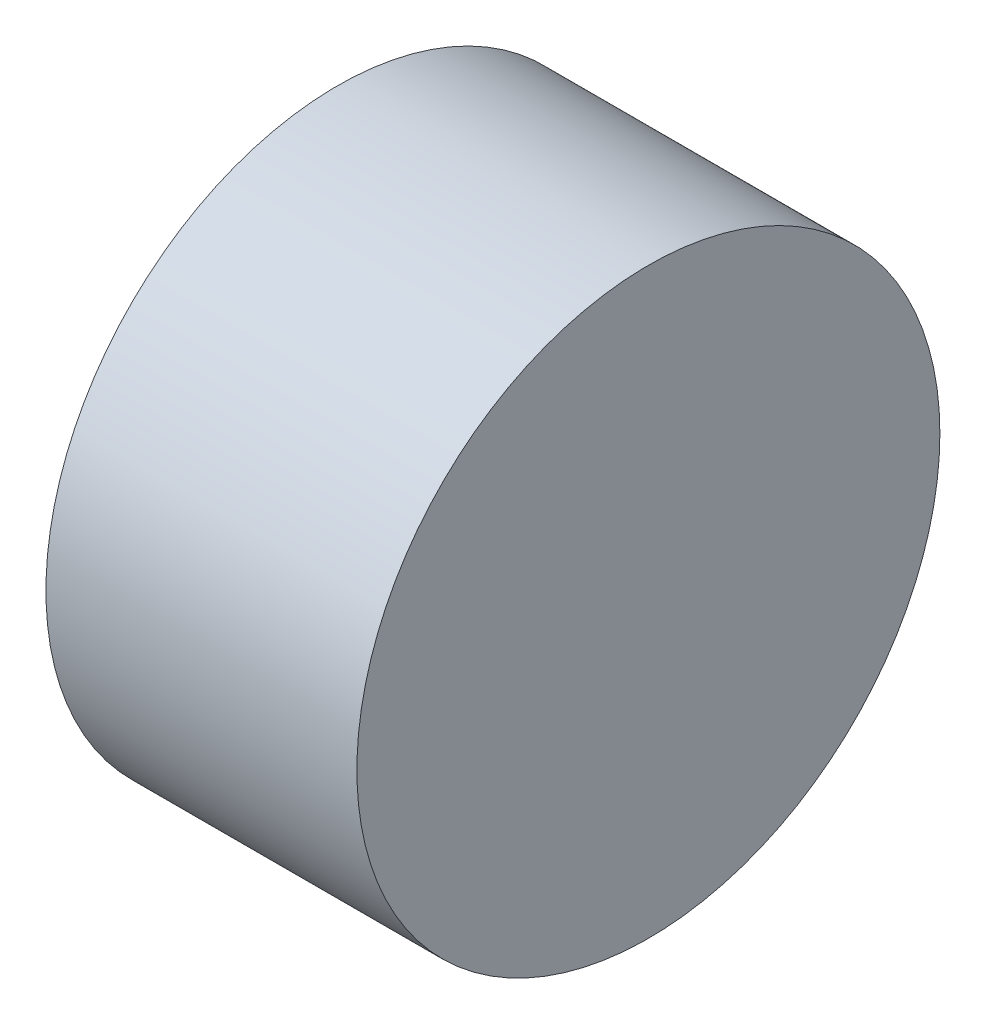
ISO-10303-21;
HEADER;
FILE_DESCRIPTION(('STEP AP214'),'2;1');
FILE_NAME('part.step','',(''),(''),'','','');
FILE_SCHEMA(('AUTOMOTIVE_DESIGN { 1 0 10303 214 1 1 1 1 }'));
ENDSEC;
DATA;
#1=APPLICATION_CONTEXT('core data for automotive mechanical design processes');
#2=APPLICATION_PROTOCOL_DEFINITION('international standard','automotive_design',2000,#1);
#3=PRODUCT_CONTEXT('',#1,'mechanical');
#4=PRODUCT('Part','Part','',(#3));
#5=PRODUCT_RELATED_PRODUCT_CATEGORY('part','',(#4));
#6=PRODUCT_DEFINITION_FORMATION('','',#4);
#7=PRODUCT_DEFINITION_CONTEXT('part definition',#1,'design');
#8=PRODUCT_DEFINITION('design','',#6,#7);
#9=PRODUCT_DEFINITION_SHAPE('','',#8);
#10=(LENGTH_UNIT() NAMED_UNIT(*) SI_UNIT(.MILLI.,.METRE.));
#11=(NAMED_UNIT(*) PLANE_ANGLE_UNIT() SI_UNIT($,.RADIAN.));
#12=(NAMED_UNIT(*) SI_UNIT($,.STERADIAN.) SOLID_ANGLE_UNIT());
#13=UNCERTAINTY_MEASURE_WITH_UNIT(LENGTH_MEASURE(1.E-05),#10,'distance_accuracy_value','');
#14=(GEOMETRIC_REPRESENTATION_CONTEXT(3) GLOBAL_UNCERTAINTY_ASSIGNED_CONTEXT((#13)) GLOBAL_UNIT_ASSIGNED_CONTEXT((#10,
#11,#12)) REPRESENTATION_CONTEXT('',''));
#15=CARTESIAN_POINT('',(0.,0.,0.));
#16=DIRECTION('',(0.,0.,1.));
#17=DIRECTION('',(1.,0.,0.));
#18=AXIS2_PLACEMENT_3D('',#15,#16,#17);
#19=CARTESIAN_POINT('',(180.2,185.4983958241,256.5200508));
#20=DIRECTION('',(1.,0.,0.));
#21=DIRECTION('',(0.,0.,-1.));
#22=AXIS2_PLACEMENT_3D('',#19,#20,#21);
#23=PLANE('',#22);
#24=CARTESIAN_POINT('',(180.200000000005,308.99854,251.50003));
#25=DIRECTION('',(1.,0.,0.));
#26=DIRECTION('',(0.,0.,-1.));
#27=AXIS2_PLACEMENT_3D('',#24,#25,#26);
#28=CIRCLE('',#27,3.);
#29=CARTESIAN_POINT('',(180.200000000005,308.99854,248.50003));
#30=VERTEX_POINT('',#29);
#31=EDGE_CURVE('E18',#30,#30,#28,.T.);
#32=ORIENTED_EDGE('',*,*,#31,.T.);
#33=EDGE_LOOP('',(#32));
#34=FACE_BOUND('',#33,.T.);
#35=ADVANCED_FACE('F14',(#34),#23,.T.);
#36=CARTESIAN_POINT('',(176.999999999995,308.99854,251.50003));
#37=DIRECTION('',(1.,0.,0.));
#38=DIRECTION('',(0.,0.,-1.));
#39=AXIS2_PLACEMENT_3D('',#36,#37,#38);
#40=CYLINDRICAL_SURFACE('',#39,3.);
#41=CARTESIAN_POINT('',(176.999999999995,308.99854,251.50003));
#42=DIRECTION('',(1.,0.,0.));
#43=DIRECTION('',(0.,0.,-1.));
#44=AXIS2_PLACEMENT_3D('',#41,#42,#43);
#45=CIRCLE('',#44,3.);
#46=CARTESIAN_POINT('',(176.999999999995,308.99854,248.50003));
#47=VERTEX_POINT('',#46);
#48=EDGE_CURVE('E10',#47,#47,#45,.F.);
#49=ORIENTED_EDGE('',*,*,#48,.F.);
#50=EDGE_LOOP('',(#49));
#51=FACE_BOUND('',#50,.T.);
#52=ORIENTED_EDGE('',*,*,#31,.F.);
#53=EDGE_LOOP('',(#52));
#54=FACE_BOUND('',#53,.T.);
#55=ADVANCED_FACE('F28',(#51,#54),#40,.T.);
#56=CARTESIAN_POINT('',(177.,294.1845609565,139.));
#57=DIRECTION('',(-1.,0.,0.));
#58=DIRECTION('',(0.,0.,1.));
#59=AXIS2_PLACEMENT_3D('',#56,#57,#58);
#60=PLANE('',#59);
#61=ORIENTED_EDGE('',*,*,#48,.T.);
#62=EDGE_LOOP('',(#61));
#63=FACE_BOUND('',#62,.T.);
#64=ADVANCED_FACE('F16',(#63),#60,.T.);
#65=CLOSED_SHELL('',(#35,#55,#64));
#66=MANIFOLD_SOLID_BREP('B1',#65);
#67=ADVANCED_BREP_SHAPE_REPRESENTATION('',(#18,#66),#14);
#68=SHAPE_DEFINITION_REPRESENTATION(#9,#67);
ENDSEC;
END-ISO-10303-21;
